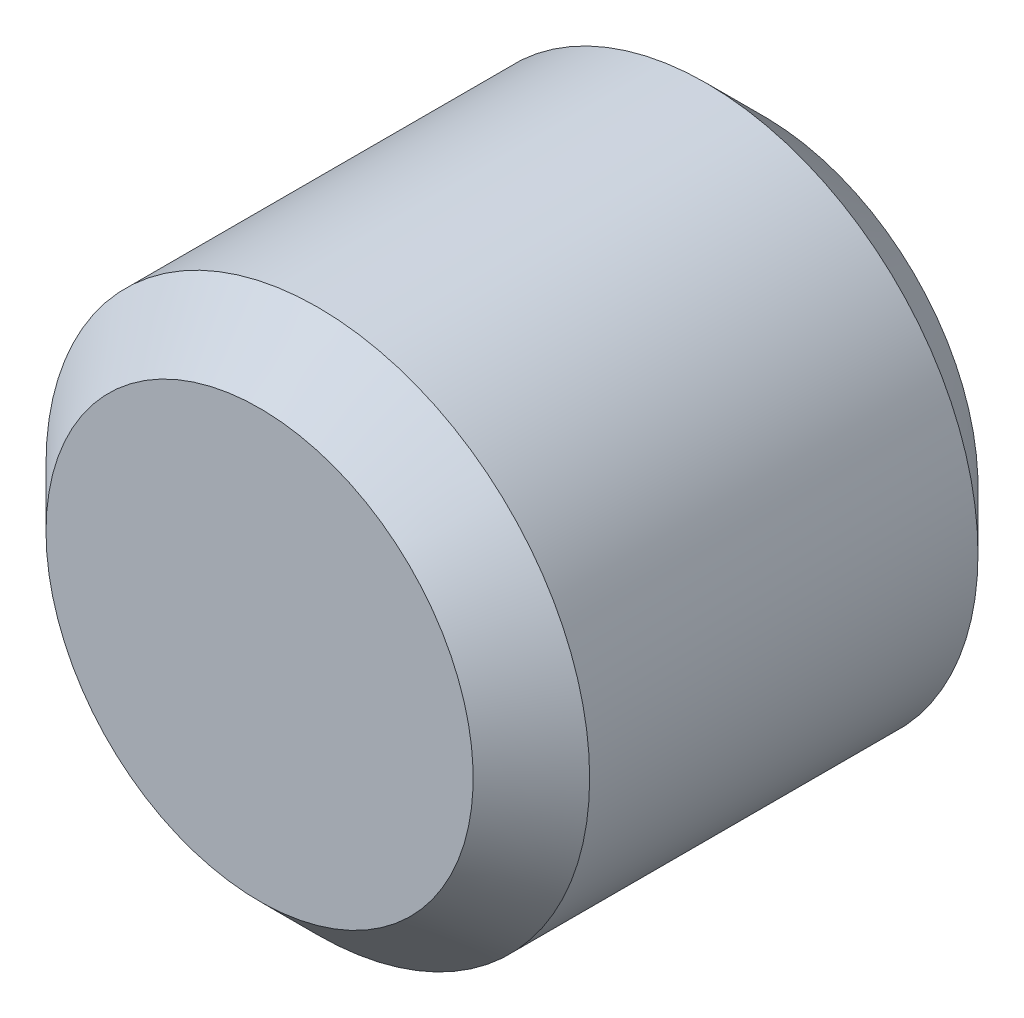
ISO-10303-21;
HEADER;
FILE_DESCRIPTION(('STEP AP214'),'2;1');
FILE_NAME('part.step','',(''),(''),'','','');
FILE_SCHEMA(('AUTOMOTIVE_DESIGN { 1 0 10303 214 1 1 1 1 }'));
ENDSEC;
DATA;
#1=APPLICATION_CONTEXT('core data for automotive mechanical design processes');
#2=APPLICATION_PROTOCOL_DEFINITION('international standard','automotive_design',2000,#1);
#3=PRODUCT_CONTEXT('',#1,'mechanical');
#4=PRODUCT('Part','Part','',(#3));
#5=PRODUCT_RELATED_PRODUCT_CATEGORY('part','',(#4));
#6=PRODUCT_DEFINITION_FORMATION('','',#4);
#7=PRODUCT_DEFINITION_CONTEXT('part definition',#1,'design');
#8=PRODUCT_DEFINITION('design','',#6,#7);
#9=PRODUCT_DEFINITION_SHAPE('','',#8);
#10=(LENGTH_UNIT() NAMED_UNIT(*) SI_UNIT(.MILLI.,.METRE.));
#11=(NAMED_UNIT(*) PLANE_ANGLE_UNIT() SI_UNIT($,.RADIAN.));
#12=(NAMED_UNIT(*) SI_UNIT($,.STERADIAN.) SOLID_ANGLE_UNIT());
#13=UNCERTAINTY_MEASURE_WITH_UNIT(LENGTH_MEASURE(1.E-05),#10,'distance_accuracy_value','');
#14=(GEOMETRIC_REPRESENTATION_CONTEXT(3) GLOBAL_UNCERTAINTY_ASSIGNED_CONTEXT((#13)) GLOBAL_UNIT_ASSIGNED_CONTEXT((#10,
#11,#12)) REPRESENTATION_CONTEXT('',''));
#15=CARTESIAN_POINT('',(0.,0.,0.));
#16=DIRECTION('',(0.,0.,1.));
#17=DIRECTION('',(1.,0.,0.));
#18=AXIS2_PLACEMENT_3D('',#15,#16,#17);
#19=CARTESIAN_POINT('',(0.,0.,0.));
#20=DIRECTION('',(0.,0.,1.));
#21=DIRECTION('',(1.,0.,0.));
#22=AXIS2_PLACEMENT_3D('',#19,#20,#21);
#23=PLANE('',#22);
#24=CARTESIAN_POINT('',(0.,0.,0.));
#25=DIRECTION('',(0.,0.,1.));
#26=DIRECTION('',(1.,0.,0.));
#27=AXIS2_PLACEMENT_3D('',#24,#25,#26);
#28=CIRCLE('',#27,11.);
#29=CARTESIAN_POINT('',(-11.,0.,0.));
#30=VERTEX_POINT('',#29);
#31=EDGE_CURVE('E38',#30,#30,#28,.T.);
#32=ORIENTED_EDGE('',*,*,#31,.T.);
#33=EDGE_LOOP('',(#32));
#34=FACE_BOUND('',#33,.T.);
#35=ADVANCED_FACE('F31',(#34),#23,.T.);
#36=CARTESIAN_POINT('',(0.,0.,-29.2));
#37=DIRECTION('',(0.,0.,-1.));
#38=DIRECTION('',(-1.,0.,0.));
#39=AXIS2_PLACEMENT_3D('',#36,#37,#38);
#40=CYLINDRICAL_SURFACE('',#39,14.);
#41=CARTESIAN_POINT('',(0.,0.,-2.99999999999999));
#42=DIRECTION('',(0.,0.,1.));
#43=DIRECTION('',(1.,0.,0.));
#44=AXIS2_PLACEMENT_3D('',#41,#42,#43);
#45=CIRCLE('',#44,14.);
#46=CARTESIAN_POINT('',(-14.,0.,-2.99999999999999));
#47=VERTEX_POINT('',#46);
#48=EDGE_CURVE('E42',#47,#47,#45,.F.);
#49=CARTESIAN_POINT('',(0.,0.,-23.));
#50=DIRECTION('',(0.,0.,-1.));
#51=DIRECTION('',(-1.,0.,0.));
#52=AXIS2_PLACEMENT_3D('',#49,#50,#51);
#53=CIRCLE('',#52,14.);
#54=CARTESIAN_POINT('',(-14.,0.,-23.));
#55=VERTEX_POINT('',#54);
#56=EDGE_CURVE('E46',#55,#55,#53,.F.);
#57=CARTESIAN_POINT('',(-14.,0.,-2.99999999999999));
#58=CARTESIAN_POINT('',(-14.,0.,-3.20833333333333));
#59=CARTESIAN_POINT('',(-14.,0.,-3.41666666666666));
#60=CARTESIAN_POINT('',(-14.,0.,-3.83333333333333));
#61=CARTESIAN_POINT('',(-14.,0.,-4.04166666666666));
#62=CARTESIAN_POINT('',(-14.,0.,-4.45833333333333));
#63=CARTESIAN_POINT('',(-14.,0.,-4.66666666666666));
#64=CARTESIAN_POINT('',(-14.,0.,-5.08333333333332));
#65=CARTESIAN_POINT('',(-14.,0.,-5.29166666666666));
#66=CARTESIAN_POINT('',(-14.,0.,-5.70833333333333));
#67=CARTESIAN_POINT('',(-14.,0.,-5.91666666666666));
#68=CARTESIAN_POINT('',(-14.,0.,-6.33333333333333));
#69=CARTESIAN_POINT('',(-14.,0.,-6.54166666666666));
#70=CARTESIAN_POINT('',(-14.,0.,-6.95833333333333));
#71=CARTESIAN_POINT('',(-14.,0.,-7.16666666666666));
#72=CARTESIAN_POINT('',(-14.,0.,-7.58333333333333));
#73=CARTESIAN_POINT('',(-14.,0.,-7.79166666666666));
#74=CARTESIAN_POINT('',(-14.,0.,-8.20833333333332));
#75=CARTESIAN_POINT('',(-14.,0.,-8.41666666666666));
#76=CARTESIAN_POINT('',(-14.,0.,-8.83333333333332));
#77=CARTESIAN_POINT('',(-14.,0.,-9.04166666666666));
#78=CARTESIAN_POINT('',(-14.,0.,-9.45833333333332));
#79=CARTESIAN_POINT('',(-14.,0.,-9.66666666666666));
#80=CARTESIAN_POINT('',(-14.,0.,-10.0833333333333));
#81=CARTESIAN_POINT('',(-14.,0.,-10.2916666666667));
#82=CARTESIAN_POINT('',(-14.,0.,-10.7083333333333));
#83=CARTESIAN_POINT('',(-14.,0.,-10.9166666666667));
#84=CARTESIAN_POINT('',(-14.,0.,-11.3333333333333));
#85=CARTESIAN_POINT('',(-14.,0.,-11.5416666666667));
#86=CARTESIAN_POINT('',(-14.,0.,-11.9583333333333));
#87=CARTESIAN_POINT('',(-14.,0.,-12.1666666666667));
#88=CARTESIAN_POINT('',(-14.,0.,-12.5833333333333));
#89=CARTESIAN_POINT('',(-14.,0.,-12.7916666666667));
#90=CARTESIAN_POINT('',(-14.,0.,-13.2083333333333));
#91=CARTESIAN_POINT('',(-14.,0.,-13.4166666666667));
#92=CARTESIAN_POINT('',(-14.,0.,-13.8333333333333));
#93=CARTESIAN_POINT('',(-14.,0.,-14.0416666666667));
#94=CARTESIAN_POINT('',(-14.,0.,-14.4583333333333));
#95=CARTESIAN_POINT('',(-14.,0.,-14.6666666666667));
#96=CARTESIAN_POINT('',(-14.,0.,-15.0833333333333));
#97=CARTESIAN_POINT('',(-14.,0.,-15.2916666666667));
#98=CARTESIAN_POINT('',(-14.,0.,-15.7083333333333));
#99=CARTESIAN_POINT('',(-14.,0.,-15.9166666666667));
#100=CARTESIAN_POINT('',(-14.,0.,-16.3333333333333));
#101=CARTESIAN_POINT('',(-14.,0.,-16.5416666666667));
#102=CARTESIAN_POINT('',(-14.,0.,-16.9583333333333));
#103=CARTESIAN_POINT('',(-14.,0.,-17.1666666666667));
#104=CARTESIAN_POINT('',(-14.,0.,-17.5833333333333));
#105=CARTESIAN_POINT('',(-14.,0.,-17.7916666666667));
#106=CARTESIAN_POINT('',(-14.,0.,-18.2083333333333));
#107=CARTESIAN_POINT('',(-14.,0.,-18.4166666666667));
#108=CARTESIAN_POINT('',(-14.,0.,-18.8333333333333));
#109=CARTESIAN_POINT('',(-14.,0.,-19.0416666666667));
#110=CARTESIAN_POINT('',(-14.,0.,-19.4583333333333));
#111=CARTESIAN_POINT('',(-14.,0.,-19.6666666666667));
#112=CARTESIAN_POINT('',(-14.,0.,-20.0833333333333));
#113=CARTESIAN_POINT('',(-14.,0.,-20.2916666666667));
#114=CARTESIAN_POINT('',(-14.,0.,-20.7083333333333));
#115=CARTESIAN_POINT('',(-14.,0.,-20.9166666666667));
#116=CARTESIAN_POINT('',(-14.,0.,-21.3333333333333));
#117=CARTESIAN_POINT('',(-14.,0.,-21.5416666666667));
#118=CARTESIAN_POINT('',(-14.,0.,-21.9583333333333));
#119=CARTESIAN_POINT('',(-14.,0.,-22.1666666666667));
#120=CARTESIAN_POINT('',(-14.,0.,-22.5833333333333));
#121=CARTESIAN_POINT('',(-14.,0.,-22.7916666666667));
#122=CARTESIAN_POINT('',(-14.,0.,-23.));
#123=B_SPLINE_CURVE_WITH_KNOTS('',3,(#57,#58,#59,#60,#61,#62,#63,#64,#65,#66,#67,#68,#69,#70,
#71,#72,#73,#74,#75,#76,#77,#78,#79,#80,#81,#82,#83,#84,#85,#86,#87,#88,#89,#90,#91,#92,#93,#94,
#95,#96,#97,#98,#99,#100,#101,#102,#103,#104,#105,#106,#107,#108,#109,#110,#111,#112,#113,#114,
#115,#116,#117,#118,#119,#120,#121,#122),.UNSPECIFIED.,.F.,.F.,(4,2,2,2,2,2,2,2,2,2,2,2,2,2,2,2,
2,2,2,2,2,2,2,2,2,2,2,2,2,2,2,2,4),(0.,0.625000000000001,1.25,1.875,2.5,3.125,3.75,4.375,5.,
5.625,6.25,6.875,7.5,8.125,8.75,9.375,10.,10.625,11.25,11.875,12.5,13.125,13.75,14.375,15.,
15.625,16.25,16.875,17.5,18.125,18.75,19.375,20.),.UNSPECIFIED.);
#124=EDGE_CURVE('BSEAM71',#47,#55,#123,.T.);
#125=ORIENTED_EDGE('',*,*,#48,.T.);
#126=ORIENTED_EDGE('',*,*,#56,.T.);
#127=ORIENTED_EDGE('',*,*,#124,.T.);
#128=ORIENTED_EDGE('',*,*,#124,.F.);
#129=EDGE_LOOP('',(#125,#127,#126,#128));
#130=FACE_BOUND('',#129,.T.);
#131=ADVANCED_FACE('F71',(#130),#40,.T.);
#132=CARTESIAN_POINT('',(-14.,0.,-26.));
#133=DIRECTION('',(0.,0.,-1.));
#134=DIRECTION('',(-1.,0.,0.));
#135=AXIS2_PLACEMENT_3D('',#132,#133,#134);
#136=PLANE('',#135);
#137=CARTESIAN_POINT('',(0.,0.,-26.));
#138=DIRECTION('',(0.,0.,-1.));
#139=DIRECTION('',(-1.,0.,0.));
#140=AXIS2_PLACEMENT_3D('',#137,#138,#139);
#141=CIRCLE('',#140,11.);
#142=CARTESIAN_POINT('',(-11.,0.,-26.));
#143=VERTEX_POINT('',#142);
#144=EDGE_CURVE('E10',#143,#143,#141,.T.);
#145=ORIENTED_EDGE('',*,*,#144,.T.);
#146=EDGE_LOOP('',(#145));
#147=FACE_BOUND('',#146,.T.);
#148=CARTESIAN_POINT('',(0.,0.,-26.));
#149=DIRECTION('',(0.,0.,-1.));
#150=DIRECTION('',(-1.,0.,0.));
#151=AXIS2_PLACEMENT_3D('',#148,#149,#150);
#152=CIRCLE('',#151,1.5);
#153=CARTESIAN_POINT('',(-1.5,0.,-26.));
#154=VERTEX_POINT('',#153);
#155=EDGE_CURVE('E51',#154,#154,#152,.T.);
#156=ORIENTED_EDGE('',*,*,#155,.F.);
#157=EDGE_LOOP('',(#156));
#158=FACE_BOUND('',#157,.T.);
#159=ADVANCED_FACE('F62',(#147,#158),#136,.T.);
#160=CARTESIAN_POINT('',(0.,0.,-29.2));
#161=DIRECTION('',(0.,0.,-1.));
#162=DIRECTION('',(-1.,0.,0.));
#163=AXIS2_PLACEMENT_3D('',#160,#161,#162);
#164=CYLINDRICAL_SURFACE('',#163,1.5);
#165=ORIENTED_EDGE('',*,*,#155,.T.);
#166=EDGE_LOOP('',(#165));
#167=FACE_BOUND('',#166,.T.);
#168=CARTESIAN_POINT('',(0.,0.,-29.2));
#169=DIRECTION('',(0.,0.,-1.));
#170=DIRECTION('',(-1.,0.,0.));
#171=AXIS2_PLACEMENT_3D('',#168,#169,#170);
#172=CIRCLE('',#171,1.5);
#173=CARTESIAN_POINT('',(-1.5,0.,-29.2));
#174=VERTEX_POINT('',#173);
#175=EDGE_CURVE('E54',#174,#174,#172,.T.);
#176=ORIENTED_EDGE('',*,*,#175,.F.);
#177=EDGE_LOOP('',(#176));
#178=FACE_BOUND('',#177,.T.);
#179=ADVANCED_FACE('F60',(#167,#178),#164,.T.);
#180=CARTESIAN_POINT('',(-1.5,0.,-29.2));
#181=DIRECTION('',(0.,0.,-1.));
#182=DIRECTION('',(-1.,0.,0.));
#183=AXIS2_PLACEMENT_3D('',#180,#181,#182);
#184=PLANE('',#183);
#185=ORIENTED_EDGE('',*,*,#175,.T.);
#186=EDGE_LOOP('',(#185));
#187=FACE_BOUND('',#186,.T.);
#188=ADVANCED_FACE('F58',(#187),#184,.T.);
#189=CARTESIAN_POINT('',(0.,0.,-2.99999999999999));
#190=DIRECTION('',(0.,0.,-1.));
#191=DIRECTION('',(-1.,0.,0.));
#192=AXIS2_PLACEMENT_3D('',#189,#190,#191);
#193=CONICAL_SURFACE('',#192,14.,0.78539816339745);
#194=CARTESIAN_POINT('',(-11.,0.,0.));
#195=CARTESIAN_POINT('',(-11.03125,0.,-0.0312499999999998));
#196=CARTESIAN_POINT('',(-11.0625,0.,-0.0624999999999996));
#197=CARTESIAN_POINT('',(-11.125,0.,-0.124999999999999));
#198=CARTESIAN_POINT('',(-11.15625,0.,-0.156249999999999));
#199=CARTESIAN_POINT('',(-11.21875,0.,-0.218749999999999));
#200=CARTESIAN_POINT('',(-11.25,0.,-0.249999999999999));
#201=CARTESIAN_POINT('',(-11.3125,0.,-0.312499999999999));
#202=CARTESIAN_POINT('',(-11.34375,0.,-0.343749999999999));
#203=CARTESIAN_POINT('',(-11.40625,0.,-0.406249999999998));
#204=CARTESIAN_POINT('',(-11.4375,0.,-0.437499999999998));
#205=CARTESIAN_POINT('',(-11.5,0.,-0.499999999999998));
#206=CARTESIAN_POINT('',(-11.53125,0.,-0.531249999999998));
#207=CARTESIAN_POINT('',(-11.59375,0.,-0.593749999999998));
#208=CARTESIAN_POINT('',(-11.625,0.,-0.624999999999998));
#209=CARTESIAN_POINT('',(-11.6875,0.,-0.687499999999998));
#210=CARTESIAN_POINT('',(-11.71875,0.,-0.718749999999998));
#211=CARTESIAN_POINT('',(-11.78125,0.,-0.781249999999998));
#212=CARTESIAN_POINT('',(-11.8125,0.,-0.812499999999998));
#213=CARTESIAN_POINT('',(-11.875,0.,-0.874999999999998));
#214=CARTESIAN_POINT('',(-11.90625,0.,-0.906249999999998));
#215=CARTESIAN_POINT('',(-11.96875,0.,-0.968749999999997));
#216=CARTESIAN_POINT('',(-12.,0.,-0.999999999999997));
#217=CARTESIAN_POINT('',(-12.0625,0.,-1.0625));
#218=CARTESIAN_POINT('',(-12.09375,0.,-1.09375));
#219=CARTESIAN_POINT('',(-12.15625,0.,-1.15625));
#220=CARTESIAN_POINT('',(-12.1875,0.,-1.1875));
#221=CARTESIAN_POINT('',(-12.25,0.,-1.25));
#222=CARTESIAN_POINT('',(-12.28125,0.,-1.28125));
#223=CARTESIAN_POINT('',(-12.34375,0.,-1.34375));
#224=CARTESIAN_POINT('',(-12.375,0.,-1.375));
#225=CARTESIAN_POINT('',(-12.4375,0.,-1.4375));
#226=CARTESIAN_POINT('',(-12.46875,0.,-1.46875));
#227=CARTESIAN_POINT('',(-12.53125,0.,-1.53125));
#228=CARTESIAN_POINT('',(-12.5625,0.,-1.5625));
#229=CARTESIAN_POINT('',(-12.625,0.,-1.625));
#230=CARTESIAN_POINT('',(-12.65625,0.,-1.65625));
#231=CARTESIAN_POINT('',(-12.71875,0.,-1.71875));
#232=CARTESIAN_POINT('',(-12.75,0.,-1.75));
#233=CARTESIAN_POINT('',(-12.8125,0.,-1.81249999999999));
#234=CARTESIAN_POINT('',(-12.84375,0.,-1.84375));
#235=CARTESIAN_POINT('',(-12.90625,0.,-1.90625));
#236=CARTESIAN_POINT('',(-12.9375,0.,-1.93749999999999));
#237=CARTESIAN_POINT('',(-13.,0.,-1.99999999999999));
#238=CARTESIAN_POINT('',(-13.03125,0.,-2.03124999999999));
#239=CARTESIAN_POINT('',(-13.09375,0.,-2.09374999999999));
#240=CARTESIAN_POINT('',(-13.125,0.,-2.12499999999999));
#241=CARTESIAN_POINT('',(-13.1875,0.,-2.18749999999999));
#242=CARTESIAN_POINT('',(-13.21875,0.,-2.21874999999999));
#243=CARTESIAN_POINT('',(-13.28125,0.,-2.28124999999999));
#244=CARTESIAN_POINT('',(-13.3125,0.,-2.31249999999999));
#245=CARTESIAN_POINT('',(-13.375,0.,-2.37499999999999));
#246=CARTESIAN_POINT('',(-13.40625,0.,-2.40624999999999));
#247=CARTESIAN_POINT('',(-13.46875,0.,-2.46874999999999));
#248=CARTESIAN_POINT('',(-13.5,0.,-2.49999999999999));
#249=CARTESIAN_POINT('',(-13.5625,0.,-2.56249999999999));
#250=CARTESIAN_POINT('',(-13.59375,0.,-2.59374999999999));
#251=CARTESIAN_POINT('',(-13.65625,0.,-2.65624999999999));
#252=CARTESIAN_POINT('',(-13.6875,0.,-2.68749999999999));
#253=CARTESIAN_POINT('',(-13.75,0.,-2.74999999999999));
#254=CARTESIAN_POINT('',(-13.78125,0.,-2.78124999999999));
#255=CARTESIAN_POINT('',(-13.84375,0.,-2.84374999999999));
#256=CARTESIAN_POINT('',(-13.875,0.,-2.87499999999999));
#257=CARTESIAN_POINT('',(-13.9375,0.,-2.93749999999999));
#258=CARTESIAN_POINT('',(-13.96875,0.,-2.96874999999999));
#259=CARTESIAN_POINT('',(-14.,0.,-2.99999999999999));
#260=B_SPLINE_CURVE_WITH_KNOTS('',3,(#194,#195,#196,#197,#198,#199,#200,#201,#202,#203,#204,
#205,#206,#207,#208,#209,#210,#211,#212,#213,#214,#215,#216,#217,#218,#219,#220,#221,#222,#223,
#224,#225,#226,#227,#228,#229,#230,#231,#232,#233,#234,#235,#236,#237,#238,#239,#240,#241,#242,
#243,#244,#245,#246,#247,#248,#249,#250,#251,#252,#253,#254,#255,#256,#257,#258,#259),
.UNSPECIFIED.,.F.,.F.,(4,2,2,2,2,2,2,2,2,2,2,2,2,2,2,2,2,2,2,2,2,2,2,2,2,2,2,2,2,2,2,2,4),(0.,
0.132582521472477,0.265165042944956,0.397747564417434,0.530330085889911,0.662912607362389,
0.795495128834867,0.928077650307344,1.06066017177982,1.1932426932523,1.32582521472478,
1.45840773619725,1.59099025766973,1.72357277914221,1.85615530061469,1.98873782208716,
2.12132034355964,2.25390286503212,2.3864853865046,2.51906790797708,2.65165042944955,
2.78423295092203,2.91681547239451,3.04939799386699,3.18198051533946,3.31456303681194,
3.44714555828442,3.5797280797569,3.71231060122937,3.84489312270185,3.97747564417433,
4.11005816564681,4.24264068711928),.UNSPECIFIED.);
#261=EDGE_CURVE('BSEAM69',#30,#47,#260,.T.);
#262=ORIENTED_EDGE('',*,*,#31,.F.);
#263=ORIENTED_EDGE('',*,*,#48,.F.);
#264=ORIENTED_EDGE('',*,*,#261,.T.);
#265=ORIENTED_EDGE('',*,*,#261,.F.);
#266=EDGE_LOOP('',(#262,#264,#263,#265));
#267=FACE_BOUND('',#266,.T.);
#268=ADVANCED_FACE('F69',(#267),#193,.T.);
#269=CARTESIAN_POINT('',(0.,0.,-26.));
#270=DIRECTION('',(0.,0.,1.));
#271=DIRECTION('',(1.,0.,0.));
#272=AXIS2_PLACEMENT_3D('',#269,#270,#271);
#273=CONICAL_SURFACE('',#272,11.,0.785398163397448);
#274=ORIENTED_EDGE('',*,*,#56,.F.);
#275=EDGE_LOOP('',(#274));
#276=FACE_BOUND('',#275,.T.);
#277=ORIENTED_EDGE('',*,*,#144,.F.);
#278=EDGE_LOOP('',(#277));
#279=FACE_BOUND('',#278,.T.);
#280=ADVANCED_FACE('F33',(#276,#279),#273,.T.);
#281=CLOSED_SHELL('',(#35,#131,#159,#179,#188,#268,#280));
#282=MANIFOLD_SOLID_BREP('B2',#281);
#283=ADVANCED_BREP_SHAPE_REPRESENTATION('',(#18,#282),#14);
#284=SHAPE_DEFINITION_REPRESENTATION(#9,#283);
ENDSEC;
END-ISO-10303-21;
